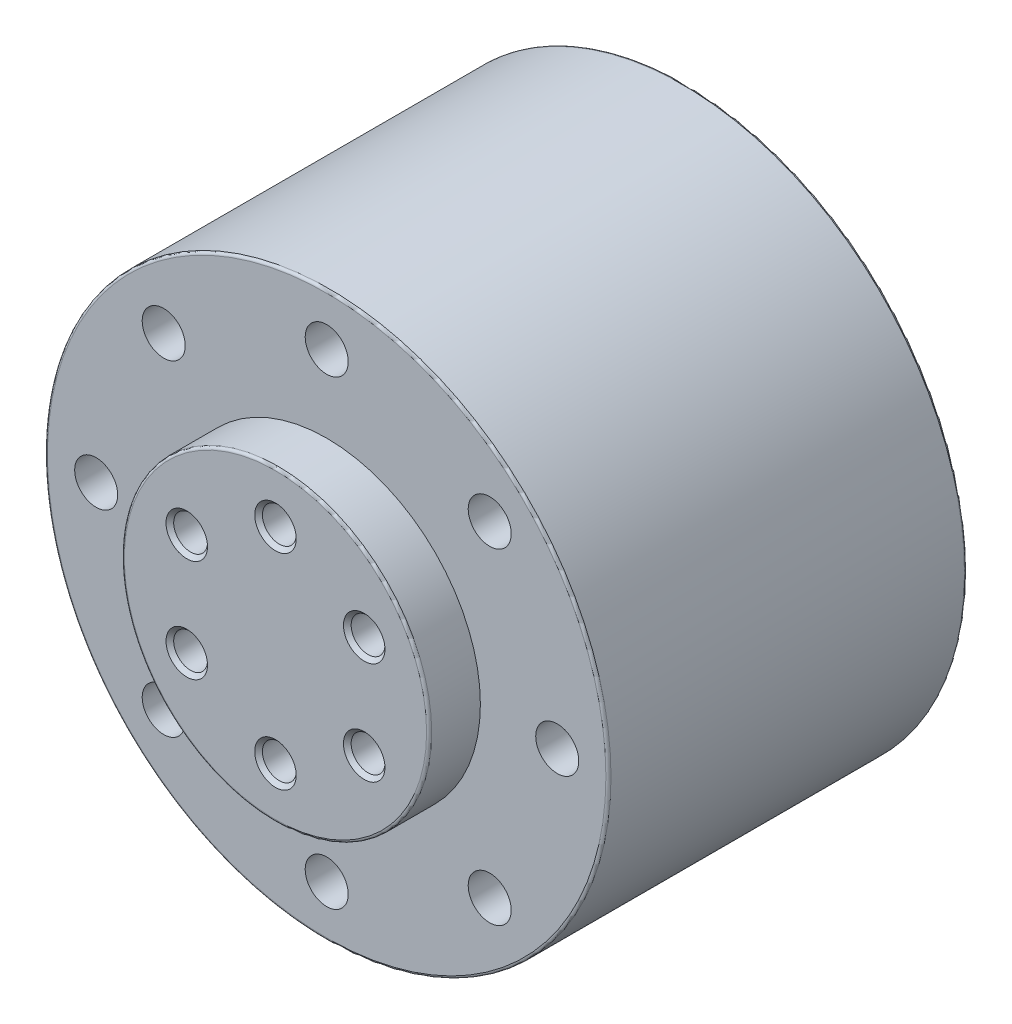
ISO-10303-21;
HEADER;
FILE_DESCRIPTION(('STEP AP214'),'2;1');
FILE_NAME('part.step','',(''),(''),'','','');
FILE_SCHEMA(('AUTOMOTIVE_DESIGN { 1 0 10303 214 1 1 1 1 }'));
ENDSEC;
DATA;
#1=APPLICATION_CONTEXT('core data for automotive mechanical design processes');
#2=APPLICATION_PROTOCOL_DEFINITION('international standard','automotive_design',2000,#1);
#3=PRODUCT_CONTEXT('',#1,'mechanical');
#4=PRODUCT('Part','Part','',(#3));
#5=PRODUCT_RELATED_PRODUCT_CATEGORY('part','',(#4));
#6=PRODUCT_DEFINITION_FORMATION('','',#4);
#7=PRODUCT_DEFINITION_CONTEXT('part definition',#1,'design');
#8=PRODUCT_DEFINITION('design','',#6,#7);
#9=PRODUCT_DEFINITION_SHAPE('','',#8);
#10=(LENGTH_UNIT() NAMED_UNIT(*) SI_UNIT(.MILLI.,.METRE.));
#11=(NAMED_UNIT(*) PLANE_ANGLE_UNIT() SI_UNIT($,.RADIAN.));
#12=(NAMED_UNIT(*) SI_UNIT($,.STERADIAN.) SOLID_ANGLE_UNIT());
#13=UNCERTAINTY_MEASURE_WITH_UNIT(LENGTH_MEASURE(1.E-05),#10,'distance_accuracy_value','');
#14=(GEOMETRIC_REPRESENTATION_CONTEXT(3) GLOBAL_UNCERTAINTY_ASSIGNED_CONTEXT((#13)) GLOBAL_UNIT_ASSIGNED_CONTEXT((#10,
#11,#12)) REPRESENTATION_CONTEXT('',''));
#15=CARTESIAN_POINT('',(0.,0.,0.));
#16=DIRECTION('',(0.,0.,1.));
#17=DIRECTION('',(1.,0.,0.));
#18=AXIS2_PLACEMENT_3D('',#15,#16,#17);
#19=CARTESIAN_POINT('',(0.,0.,0.));
#20=DIRECTION('',(0.,0.,1.));
#21=DIRECTION('',(1.,0.,0.));
#22=AXIS2_PLACEMENT_3D('',#19,#20,#21);
#23=PLANE('',#22);
#24=CARTESIAN_POINT('',(0.,0.,0.));
#25=DIRECTION('',(0.,0.,1.));
#26=DIRECTION('',(1.,0.,0.));
#27=AXIS2_PLACEMENT_3D('',#24,#25,#26);
#28=CIRCLE('',#27,27.25);
#29=CARTESIAN_POINT('',(27.25,0.,0.));
#30=VERTEX_POINT('',#29);
#31=EDGE_CURVE('E11',#30,#30,#28,.F.);
#32=ORIENTED_EDGE('',*,*,#31,.T.);
#33=EDGE_LOOP('',(#32));
#34=FACE_BOUND('',#33,.T.);
#35=CARTESIAN_POINT('',(-15.9099025766973,15.9099025766973,0.));
#36=DIRECTION('',(0.,0.,-1.));
#37=DIRECTION('',(-1.,0.,0.));
#38=AXIS2_PLACEMENT_3D('',#35,#36,#37);
#39=CIRCLE('',#38,2.525);
#40=CARTESIAN_POINT('',(-18.4349025766973,15.9099025766973,0.));
#41=VERTEX_POINT('',#40);
#42=EDGE_CURVE('E140',#41,#41,#39,.T.);
#43=ORIENTED_EDGE('',*,*,#42,.F.);
#44=EDGE_LOOP('',(#43));
#45=FACE_BOUND('',#44,.T.);
#46=CARTESIAN_POINT('',(-22.5,0.,0.));
#47=DIRECTION('',(0.,0.,-1.));
#48=DIRECTION('',(-1.,0.,0.));
#49=AXIS2_PLACEMENT_3D('',#46,#47,#48);
#50=CIRCLE('',#49,2.525);
#51=CARTESIAN_POINT('',(-25.025,0.,0.));
#52=VERTEX_POINT('',#51);
#53=EDGE_CURVE('E149',#52,#52,#50,.T.);
#54=ORIENTED_EDGE('',*,*,#53,.F.);
#55=EDGE_LOOP('',(#54));
#56=FACE_BOUND('',#55,.T.);
#57=CARTESIAN_POINT('',(-15.9099025766973,-15.9099025766973,0.));
#58=DIRECTION('',(0.,0.,-1.));
#59=DIRECTION('',(-1.,0.,0.));
#60=AXIS2_PLACEMENT_3D('',#57,#58,#59);
#61=CIRCLE('',#60,2.525);
#62=CARTESIAN_POINT('',(-18.4349025766973,-15.9099025766973,0.));
#63=VERTEX_POINT('',#62);
#64=EDGE_CURVE('E158',#63,#63,#61,.T.);
#65=ORIENTED_EDGE('',*,*,#64,.F.);
#66=EDGE_LOOP('',(#65));
#67=FACE_BOUND('',#66,.T.);
#68=CARTESIAN_POINT('',(0.,-22.5,0.));
#69=DIRECTION('',(0.,0.,-1.));
#70=DIRECTION('',(-1.,0.,0.));
#71=AXIS2_PLACEMENT_3D('',#68,#69,#70);
#72=CIRCLE('',#71,2.525);
#73=CARTESIAN_POINT('',(-2.525,-22.5,0.));
#74=VERTEX_POINT('',#73);
#75=EDGE_CURVE('E167',#74,#74,#72,.T.);
#76=ORIENTED_EDGE('',*,*,#75,.F.);
#77=EDGE_LOOP('',(#76));
#78=FACE_BOUND('',#77,.T.);
#79=CARTESIAN_POINT('',(15.9099025766973,-15.9099025766973,0.));
#80=DIRECTION('',(0.,0.,-1.));
#81=DIRECTION('',(-1.,0.,0.));
#82=AXIS2_PLACEMENT_3D('',#79,#80,#81);
#83=CIRCLE('',#82,2.525);
#84=CARTESIAN_POINT('',(13.3849025766973,-15.9099025766973,0.));
#85=VERTEX_POINT('',#84);
#86=EDGE_CURVE('E176',#85,#85,#83,.T.);
#87=ORIENTED_EDGE('',*,*,#86,.F.);
#88=EDGE_LOOP('',(#87));
#89=FACE_BOUND('',#88,.T.);
#90=CARTESIAN_POINT('',(22.5,0.,0.));
#91=DIRECTION('',(0.,0.,-1.));
#92=DIRECTION('',(-1.,0.,0.));
#93=AXIS2_PLACEMENT_3D('',#90,#91,#92);
#94=CIRCLE('',#93,2.525);
#95=CARTESIAN_POINT('',(19.975,0.,0.));
#96=VERTEX_POINT('',#95);
#97=EDGE_CURVE('E185',#96,#96,#94,.T.);
#98=ORIENTED_EDGE('',*,*,#97,.F.);
#99=EDGE_LOOP('',(#98));
#100=FACE_BOUND('',#99,.T.);
#101=CARTESIAN_POINT('',(15.9099025766973,15.9099025766973,0.));
#102=DIRECTION('',(0.,0.,-1.));
#103=DIRECTION('',(-1.,0.,0.));
#104=AXIS2_PLACEMENT_3D('',#101,#102,#103);
#105=CIRCLE('',#104,2.525);
#106=CARTESIAN_POINT('',(13.3849025766973,15.9099025766973,0.));
#107=VERTEX_POINT('',#106);
#108=EDGE_CURVE('E194',#107,#107,#105,.T.);
#109=ORIENTED_EDGE('',*,*,#108,.F.);
#110=EDGE_LOOP('',(#109));
#111=FACE_BOUND('',#110,.T.);
#112=CARTESIAN_POINT('',(0.,22.5,0.));
#113=DIRECTION('',(0.,0.,-1.));
#114=DIRECTION('',(-1.,0.,0.));
#115=AXIS2_PLACEMENT_3D('',#112,#113,#114);
#116=CIRCLE('',#115,2.525);
#117=CARTESIAN_POINT('',(-2.525,22.5,0.));
#118=VERTEX_POINT('',#117);
#119=EDGE_CURVE('E131',#118,#118,#116,.T.);
#120=ORIENTED_EDGE('',*,*,#119,.F.);
#121=EDGE_LOOP('',(#120));
#122=FACE_BOUND('',#121,.T.);
#123=ADVANCED_FACE('F42',(#34,#45,#56,#67,#78,#89,#100,#111,#122),#23,.F.);
#124=CARTESIAN_POINT('',(0.,0.,35.));
#125=DIRECTION('',(0.,0.,-1.));
#126=DIRECTION('',(-1.,0.,0.));
#127=AXIS2_PLACEMENT_3D('',#124,#125,#126);
#128=CYLINDRICAL_SURFACE('',#127,27.5);
#129=CARTESIAN_POINT('',(0.,0.,34.75));
#130=DIRECTION('',(0.,0.,1.));
#131=DIRECTION('',(1.,0.,0.));
#132=AXIS2_PLACEMENT_3D('',#129,#130,#131);
#133=CIRCLE('',#132,27.5);
#134=CARTESIAN_POINT('',(27.5,0.,34.75));
#135=VERTEX_POINT('',#134);
#136=EDGE_CURVE('E50',#135,#135,#133,.F.);
#137=ORIENTED_EDGE('',*,*,#136,.T.);
#138=EDGE_LOOP('',(#137));
#139=FACE_BOUND('',#138,.T.);
#140=CARTESIAN_POINT('',(0.,0.,0.25));
#141=DIRECTION('',(0.,0.,1.));
#142=DIRECTION('',(1.,0.,0.));
#143=AXIS2_PLACEMENT_3D('',#140,#141,#142);
#144=CIRCLE('',#143,27.5);
#145=CARTESIAN_POINT('',(27.5,0.,0.25));
#146=VERTEX_POINT('',#145);
#147=EDGE_CURVE('E215',#146,#146,#144,.T.);
#148=ORIENTED_EDGE('',*,*,#147,.T.);
#149=EDGE_LOOP('',(#148));
#150=FACE_BOUND('',#149,.T.);
#151=ADVANCED_FACE('F220',(#139,#150),#128,.T.);
#152=CARTESIAN_POINT('',(0.,0.,35.));
#153=DIRECTION('',(0.,0.,1.));
#154=DIRECTION('',(1.,0.,0.));
#155=AXIS2_PLACEMENT_3D('',#152,#153,#154);
#156=PLANE('',#155);
#157=CARTESIAN_POINT('',(0.,0.,35.));
#158=DIRECTION('',(0.,0.,1.));
#159=DIRECTION('',(1.,0.,0.));
#160=AXIS2_PLACEMENT_3D('',#157,#158,#159);
#161=CIRCLE('',#160,27.25);
#162=CARTESIAN_POINT('',(27.25,0.,35.));
#163=VERTEX_POINT('',#162);
#164=EDGE_CURVE('E212',#163,#163,#161,.T.);
#165=ORIENTED_EDGE('',*,*,#164,.T.);
#166=EDGE_LOOP('',(#165));
#167=FACE_BOUND('',#166,.T.);
#168=CARTESIAN_POINT('',(0.,22.5,35.));
#169=DIRECTION('',(0.,0.,1.));
#170=DIRECTION('',(1.,0.,0.));
#171=AXIS2_PLACEMENT_3D('',#168,#169,#170);
#172=CIRCLE('',#171,2.1);
#173=CARTESIAN_POINT('',(2.1,22.5,35.));
#174=VERTEX_POINT('',#173);
#175=EDGE_CURVE('E137',#174,#174,#172,.T.);
#176=ORIENTED_EDGE('',*,*,#175,.F.);
#177=EDGE_LOOP('',(#176));
#178=FACE_BOUND('',#177,.T.);
#179=CARTESIAN_POINT('',(-15.9099025766973,15.9099025766973,35.));
#180=DIRECTION('',(0.,0.,1.));
#181=DIRECTION('',(1.,0.,0.));
#182=AXIS2_PLACEMENT_3D('',#179,#180,#181);
#183=CIRCLE('',#182,2.09999999999999);
#184=CARTESIAN_POINT('',(-13.8099025766973,15.9099025766973,35.));
#185=VERTEX_POINT('',#184);
#186=EDGE_CURVE('E146',#185,#185,#183,.T.);
#187=ORIENTED_EDGE('',*,*,#186,.F.);
#188=EDGE_LOOP('',(#187));
#189=FACE_BOUND('',#188,.T.);
#190=CARTESIAN_POINT('',(-22.5,0.,35.));
#191=DIRECTION('',(0.,0.,1.));
#192=DIRECTION('',(1.,0.,0.));
#193=AXIS2_PLACEMENT_3D('',#190,#191,#192);
#194=CIRCLE('',#193,2.09999999999999);
#195=CARTESIAN_POINT('',(-20.4,0.,35.));
#196=VERTEX_POINT('',#195);
#197=EDGE_CURVE('E155',#196,#196,#194,.T.);
#198=ORIENTED_EDGE('',*,*,#197,.F.);
#199=EDGE_LOOP('',(#198));
#200=FACE_BOUND('',#199,.T.);
#201=CARTESIAN_POINT('',(-15.9099025766973,-15.9099025766973,35.));
#202=DIRECTION('',(0.,0.,1.));
#203=DIRECTION('',(1.,0.,0.));
#204=AXIS2_PLACEMENT_3D('',#201,#202,#203);
#205=CIRCLE('',#204,2.09999999999999);
#206=CARTESIAN_POINT('',(-13.8099025766973,-15.9099025766973,35.));
#207=VERTEX_POINT('',#206);
#208=EDGE_CURVE('E164',#207,#207,#205,.T.);
#209=ORIENTED_EDGE('',*,*,#208,.F.);
#210=EDGE_LOOP('',(#209));
#211=FACE_BOUND('',#210,.T.);
#212=CARTESIAN_POINT('',(0.,-22.5,35.));
#213=DIRECTION('',(0.,0.,1.));
#214=DIRECTION('',(1.,0.,0.));
#215=AXIS2_PLACEMENT_3D('',#212,#213,#214);
#216=CIRCLE('',#215,2.1);
#217=CARTESIAN_POINT('',(2.09999999999999,-22.5,35.));
#218=VERTEX_POINT('',#217);
#219=EDGE_CURVE('E173',#218,#218,#216,.T.);
#220=ORIENTED_EDGE('',*,*,#219,.F.);
#221=EDGE_LOOP('',(#220));
#222=FACE_BOUND('',#221,.T.);
#223=CARTESIAN_POINT('',(15.9099025766973,-15.9099025766973,35.));
#224=DIRECTION('',(0.,0.,1.));
#225=DIRECTION('',(1.,0.,0.));
#226=AXIS2_PLACEMENT_3D('',#223,#224,#225);
#227=CIRCLE('',#226,2.09999999999999);
#228=CARTESIAN_POINT('',(18.0099025766973,-15.9099025766973,35.));
#229=VERTEX_POINT('',#228);
#230=EDGE_CURVE('E182',#229,#229,#227,.T.);
#231=ORIENTED_EDGE('',*,*,#230,.F.);
#232=EDGE_LOOP('',(#231));
#233=FACE_BOUND('',#232,.T.);
#234=CARTESIAN_POINT('',(22.5,0.,35.));
#235=DIRECTION('',(0.,0.,1.));
#236=DIRECTION('',(1.,0.,0.));
#237=AXIS2_PLACEMENT_3D('',#234,#235,#236);
#238=CIRCLE('',#237,2.09999999999999);
#239=CARTESIAN_POINT('',(24.6,0.,35.));
#240=VERTEX_POINT('',#239);
#241=EDGE_CURVE('E191',#240,#240,#238,.T.);
#242=ORIENTED_EDGE('',*,*,#241,.F.);
#243=EDGE_LOOP('',(#242));
#244=FACE_BOUND('',#243,.T.);
#245=CARTESIAN_POINT('',(15.9099025766973,15.9099025766973,35.));
#246=DIRECTION('',(0.,0.,1.));
#247=DIRECTION('',(1.,0.,0.));
#248=AXIS2_PLACEMENT_3D('',#245,#246,#247);
#249=CIRCLE('',#248,2.09999999999999);
#250=CARTESIAN_POINT('',(18.0099025766973,15.9099025766973,35.));
#251=VERTEX_POINT('',#250);
#252=EDGE_CURVE('E200',#251,#251,#249,.T.);
#253=ORIENTED_EDGE('',*,*,#252,.F.);
#254=EDGE_LOOP('',(#253));
#255=FACE_BOUND('',#254,.T.);
#256=CARTESIAN_POINT('',(0.,0.,35.));
#257=DIRECTION('',(0.,0.,1.));
#258=DIRECTION('',(1.,0.,0.));
#259=AXIS2_PLACEMENT_3D('',#256,#257,#258);
#260=CIRCLE('',#259,15.);
#261=CARTESIAN_POINT('',(15.,0.,35.));
#262=VERTEX_POINT('',#261);
#263=EDGE_CURVE('E203',#262,#262,#260,.T.);
#264=ORIENTED_EDGE('',*,*,#263,.F.);
#265=EDGE_LOOP('',(#264));
#266=FACE_BOUND('',#265,.T.);
#267=ADVANCED_FACE('F229',(#167,#178,#189,#200,#211,#222,#233,#244,#255,#266),#156,.T.);
#268=CARTESIAN_POINT('',(0.,0.,40.));
#269=DIRECTION('',(0.,0.,-1.));
#270=DIRECTION('',(-1.,0.,0.));
#271=AXIS2_PLACEMENT_3D('',#268,#269,#270);
#272=CYLINDRICAL_SURFACE('',#271,15.);
#273=CARTESIAN_POINT('',(0.,0.,39.75));
#274=DIRECTION('',(0.,0.,1.));
#275=DIRECTION('',(1.,0.,0.));
#276=AXIS2_PLACEMENT_3D('',#273,#274,#275);
#277=CIRCLE('',#276,15.);
#278=CARTESIAN_POINT('',(15.,0.,39.75));
#279=VERTEX_POINT('',#278);
#280=EDGE_CURVE('E209',#279,#279,#277,.F.);
#281=ORIENTED_EDGE('',*,*,#280,.T.);
#282=EDGE_LOOP('',(#281));
#283=FACE_BOUND('',#282,.T.);
#284=ORIENTED_EDGE('',*,*,#263,.T.);
#285=EDGE_LOOP('',(#284));
#286=FACE_BOUND('',#285,.T.);
#287=ADVANCED_FACE('F232',(#283,#286),#272,.T.);
#288=CARTESIAN_POINT('',(0.,0.,40.));
#289=DIRECTION('',(0.,0.,1.));
#290=DIRECTION('',(1.,0.,0.));
#291=AXIS2_PLACEMENT_3D('',#288,#289,#290);
#292=PLANE('',#291);
#293=CARTESIAN_POINT('',(0.,0.,40.));
#294=DIRECTION('',(0.,0.,1.));
#295=DIRECTION('',(1.,0.,0.));
#296=AXIS2_PLACEMENT_3D('',#293,#294,#295);
#297=CIRCLE('',#296,14.75);
#298=CARTESIAN_POINT('',(14.75,0.,40.));
#299=VERTEX_POINT('',#298);
#300=EDGE_CURVE('E206',#299,#299,#297,.T.);
#301=ORIENTED_EDGE('',*,*,#300,.T.);
#302=EDGE_LOOP('',(#301));
#303=FACE_BOUND('',#302,.T.);
#304=CARTESIAN_POINT('',(0.,10.,40.));
#305=DIRECTION('',(0.,0.,1.));
#306=DIRECTION('',(1.,0.,0.));
#307=AXIS2_PLACEMENT_3D('',#304,#305,#306);
#308=CIRCLE('',#307,2.025);
#309=CARTESIAN_POINT('',(2.025,10.,40.));
#310=VERTEX_POINT('',#309);
#311=EDGE_CURVE('E86',#310,#310,#308,.T.);
#312=ORIENTED_EDGE('',*,*,#311,.F.);
#313=EDGE_LOOP('',(#312));
#314=FACE_BOUND('',#313,.T.);
#315=CARTESIAN_POINT('',(8.66025403784439,5.,40.));
#316=DIRECTION('',(0.,0.,1.));
#317=DIRECTION('',(1.,0.,0.));
#318=AXIS2_PLACEMENT_3D('',#315,#316,#317);
#319=CIRCLE('',#318,2.025);
#320=CARTESIAN_POINT('',(10.6852540378444,5.,40.));
#321=VERTEX_POINT('',#320);
#322=EDGE_CURVE('E79',#321,#321,#319,.T.);
#323=ORIENTED_EDGE('',*,*,#322,.F.);
#324=EDGE_LOOP('',(#323));
#325=FACE_BOUND('',#324,.T.);
#326=CARTESIAN_POINT('',(8.66025403784439,-5.,40.));
#327=DIRECTION('',(0.,0.,1.));
#328=DIRECTION('',(1.,0.,0.));
#329=AXIS2_PLACEMENT_3D('',#326,#327,#328);
#330=CIRCLE('',#329,2.025);
#331=CARTESIAN_POINT('',(10.6852540378444,-5.,40.));
#332=VERTEX_POINT('',#331);
#333=EDGE_CURVE('E95',#332,#332,#330,.T.);
#334=ORIENTED_EDGE('',*,*,#333,.F.);
#335=EDGE_LOOP('',(#334));
#336=FACE_BOUND('',#335,.T.);
#337=CARTESIAN_POINT('',(0.,-10.,40.));
#338=DIRECTION('',(0.,0.,1.));
#339=DIRECTION('',(1.,0.,0.));
#340=AXIS2_PLACEMENT_3D('',#337,#338,#339);
#341=CIRCLE('',#340,2.025);
#342=CARTESIAN_POINT('',(2.025,-10.,40.));
#343=VERTEX_POINT('',#342);
#344=EDGE_CURVE('E104',#343,#343,#341,.T.);
#345=ORIENTED_EDGE('',*,*,#344,.F.);
#346=EDGE_LOOP('',(#345));
#347=FACE_BOUND('',#346,.T.);
#348=CARTESIAN_POINT('',(-8.66025403784439,-5.00000000000001,40.));
#349=DIRECTION('',(0.,0.,1.));
#350=DIRECTION('',(1.,0.,0.));
#351=AXIS2_PLACEMENT_3D('',#348,#349,#350);
#352=CIRCLE('',#351,2.025);
#353=CARTESIAN_POINT('',(-6.63525403784439,-5.00000000000001,40.));
#354=VERTEX_POINT('',#353);
#355=EDGE_CURVE('E113',#354,#354,#352,.T.);
#356=ORIENTED_EDGE('',*,*,#355,.F.);
#357=EDGE_LOOP('',(#356));
#358=FACE_BOUND('',#357,.T.);
#359=CARTESIAN_POINT('',(-8.66025403784439,4.99999999999999,40.));
#360=DIRECTION('',(0.,0.,1.));
#361=DIRECTION('',(1.,0.,0.));
#362=AXIS2_PLACEMENT_3D('',#359,#360,#361);
#363=CIRCLE('',#362,2.025);
#364=CARTESIAN_POINT('',(-6.63525403784439,4.99999999999999,40.));
#365=VERTEX_POINT('',#364);
#366=EDGE_CURVE('E122',#365,#365,#363,.T.);
#367=ORIENTED_EDGE('',*,*,#366,.F.);
#368=EDGE_LOOP('',(#367));
#369=FACE_BOUND('',#368,.T.);
#370=ADVANCED_FACE('F253',(#303,#314,#325,#336,#347,#358,#369),#292,.T.);
#371=CARTESIAN_POINT('',(15.9099025766973,15.9099025766973,0.));
#372=DIRECTION('',(0.,0.,-1.));
#373=DIRECTION('',(-1.,0.,0.));
#374=AXIS2_PLACEMENT_3D('',#371,#372,#373);
#375=CYLINDRICAL_SURFACE('',#374,2.09999999999999);
#376=CARTESIAN_POINT('',(15.9099025766973,15.9099025766973,0.425000000000003));
#377=DIRECTION('',(0.,0.,-1.));
#378=DIRECTION('',(-1.,0.,0.));
#379=AXIS2_PLACEMENT_3D('',#376,#377,#378);
#380=CIRCLE('',#379,2.1);
#381=CARTESIAN_POINT('',(13.8099025766973,15.9099025766973,0.425000000000003));
#382=VERTEX_POINT('',#381);
#383=EDGE_CURVE('E197',#382,#382,#380,.T.);
#384=ORIENTED_EDGE('',*,*,#383,.T.);
#385=EDGE_LOOP('',(#384));
#386=FACE_BOUND('',#385,.T.);
#387=ORIENTED_EDGE('',*,*,#252,.T.);
#388=EDGE_LOOP('',(#387));
#389=FACE_BOUND('',#388,.T.);
#390=ADVANCED_FACE('F259',(#386,#389),#375,.F.);
#391=CARTESIAN_POINT('',(15.9099025766973,15.9099025766973,0.));
#392=DIRECTION('',(0.,0.,-1.));
#393=DIRECTION('',(-1.,0.,0.));
#394=AXIS2_PLACEMENT_3D('',#391,#392,#393);
#395=CONICAL_SURFACE('',#394,2.525,0.785398163397444);
#396=ORIENTED_EDGE('',*,*,#383,.F.);
#397=EDGE_LOOP('',(#396));
#398=FACE_BOUND('',#397,.T.);
#399=ORIENTED_EDGE('',*,*,#108,.T.);
#400=EDGE_LOOP('',(#399));
#401=FACE_BOUND('',#400,.T.);
#402=ADVANCED_FACE('F371',(#398,#401),#395,.F.);
#403=CARTESIAN_POINT('',(22.5,0.,0.));
#404=DIRECTION('',(0.,0.,-1.));
#405=DIRECTION('',(-1.,0.,0.));
#406=AXIS2_PLACEMENT_3D('',#403,#404,#405);
#407=CYLINDRICAL_SURFACE('',#406,2.09999999999999);
#408=CARTESIAN_POINT('',(22.5,0.,0.425000000000003));
#409=DIRECTION('',(0.,0.,-1.));
#410=DIRECTION('',(-1.,0.,0.));
#411=AXIS2_PLACEMENT_3D('',#408,#409,#410);
#412=CIRCLE('',#411,2.1);
#413=CARTESIAN_POINT('',(20.4,0.,0.425000000000003));
#414=VERTEX_POINT('',#413);
#415=EDGE_CURVE('E188',#414,#414,#412,.T.);
#416=ORIENTED_EDGE('',*,*,#415,.T.);
#417=EDGE_LOOP('',(#416));
#418=FACE_BOUND('',#417,.T.);
#419=ORIENTED_EDGE('',*,*,#241,.T.);
#420=EDGE_LOOP('',(#419));
#421=FACE_BOUND('',#420,.T.);
#422=ADVANCED_FACE('F367',(#418,#421),#407,.F.);
#423=CARTESIAN_POINT('',(22.5,0.,0.));
#424=DIRECTION('',(0.,0.,-1.));
#425=DIRECTION('',(-1.,0.,0.));
#426=AXIS2_PLACEMENT_3D('',#423,#424,#425);
#427=CONICAL_SURFACE('',#426,2.525,0.785398163397444);
#428=ORIENTED_EDGE('',*,*,#415,.F.);
#429=EDGE_LOOP('',(#428));
#430=FACE_BOUND('',#429,.T.);
#431=ORIENTED_EDGE('',*,*,#97,.T.);
#432=EDGE_LOOP('',(#431));
#433=FACE_BOUND('',#432,.T.);
#434=ADVANCED_FACE('F363',(#430,#433),#427,.F.);
#435=CARTESIAN_POINT('',(15.9099025766973,-15.9099025766973,0.));
#436=DIRECTION('',(0.,0.,-1.));
#437=DIRECTION('',(-1.,0.,0.));
#438=AXIS2_PLACEMENT_3D('',#435,#436,#437);
#439=CYLINDRICAL_SURFACE('',#438,2.09999999999999);
#440=CARTESIAN_POINT('',(15.9099025766973,-15.9099025766973,0.425000000000003));
#441=DIRECTION('',(0.,0.,-1.));
#442=DIRECTION('',(-1.,0.,0.));
#443=AXIS2_PLACEMENT_3D('',#440,#441,#442);
#444=CIRCLE('',#443,2.1);
#445=CARTESIAN_POINT('',(13.8099025766973,-15.9099025766973,0.425000000000003));
#446=VERTEX_POINT('',#445);
#447=EDGE_CURVE('E179',#446,#446,#444,.T.);
#448=ORIENTED_EDGE('',*,*,#447,.T.);
#449=EDGE_LOOP('',(#448));
#450=FACE_BOUND('',#449,.T.);
#451=ORIENTED_EDGE('',*,*,#230,.T.);
#452=EDGE_LOOP('',(#451));
#453=FACE_BOUND('',#452,.T.);
#454=ADVANCED_FACE('F359',(#450,#453),#439,.F.);
#455=CARTESIAN_POINT('',(15.9099025766973,-15.9099025766973,0.));
#456=DIRECTION('',(0.,0.,-1.));
#457=DIRECTION('',(-1.,0.,0.));
#458=AXIS2_PLACEMENT_3D('',#455,#456,#457);
#459=CONICAL_SURFACE('',#458,2.525,0.785398163397444);
#460=ORIENTED_EDGE('',*,*,#447,.F.);
#461=EDGE_LOOP('',(#460));
#462=FACE_BOUND('',#461,.T.);
#463=ORIENTED_EDGE('',*,*,#86,.T.);
#464=EDGE_LOOP('',(#463));
#465=FACE_BOUND('',#464,.T.);
#466=ADVANCED_FACE('F355',(#462,#465),#459,.F.);
#467=CARTESIAN_POINT('',(0.,-22.5,0.));
#468=DIRECTION('',(0.,0.,-1.));
#469=DIRECTION('',(-1.,0.,0.));
#470=AXIS2_PLACEMENT_3D('',#467,#468,#469);
#471=CYLINDRICAL_SURFACE('',#470,2.1);
#472=CARTESIAN_POINT('',(0.,-22.5,0.425000000000003));
#473=DIRECTION('',(0.,0.,-1.));
#474=DIRECTION('',(-1.,0.,0.));
#475=AXIS2_PLACEMENT_3D('',#472,#473,#474);
#476=CIRCLE('',#475,2.1);
#477=CARTESIAN_POINT('',(-2.1,-22.5,0.425000000000003));
#478=VERTEX_POINT('',#477);
#479=EDGE_CURVE('E170',#478,#478,#476,.T.);
#480=ORIENTED_EDGE('',*,*,#479,.T.);
#481=EDGE_LOOP('',(#480));
#482=FACE_BOUND('',#481,.T.);
#483=ORIENTED_EDGE('',*,*,#219,.T.);
#484=EDGE_LOOP('',(#483));
#485=FACE_BOUND('',#484,.T.);
#486=ADVANCED_FACE('F351',(#482,#485),#471,.F.);
#487=CARTESIAN_POINT('',(0.,-22.5,0.));
#488=DIRECTION('',(0.,0.,-1.));
#489=DIRECTION('',(-1.,0.,0.));
#490=AXIS2_PLACEMENT_3D('',#487,#488,#489);
#491=CONICAL_SURFACE('',#490,2.525,0.785398163397443);
#492=ORIENTED_EDGE('',*,*,#479,.F.);
#493=EDGE_LOOP('',(#492));
#494=FACE_BOUND('',#493,.T.);
#495=ORIENTED_EDGE('',*,*,#75,.T.);
#496=EDGE_LOOP('',(#495));
#497=FACE_BOUND('',#496,.T.);
#498=ADVANCED_FACE('F347',(#494,#497),#491,.F.);
#499=CARTESIAN_POINT('',(-15.9099025766973,-15.9099025766973,0.));
#500=DIRECTION('',(0.,0.,-1.));
#501=DIRECTION('',(-1.,0.,0.));
#502=AXIS2_PLACEMENT_3D('',#499,#500,#501);
#503=CYLINDRICAL_SURFACE('',#502,2.09999999999999);
#504=CARTESIAN_POINT('',(-15.9099025766973,-15.9099025766973,0.425000000000003));
#505=DIRECTION('',(0.,0.,-1.));
#506=DIRECTION('',(-1.,0.,0.));
#507=AXIS2_PLACEMENT_3D('',#504,#505,#506);
#508=CIRCLE('',#507,2.1);
#509=CARTESIAN_POINT('',(-18.0099025766973,-15.9099025766973,0.425000000000003));
#510=VERTEX_POINT('',#509);
#511=EDGE_CURVE('E161',#510,#510,#508,.T.);
#512=ORIENTED_EDGE('',*,*,#511,.T.);
#513=EDGE_LOOP('',(#512));
#514=FACE_BOUND('',#513,.T.);
#515=ORIENTED_EDGE('',*,*,#208,.T.);
#516=EDGE_LOOP('',(#515));
#517=FACE_BOUND('',#516,.T.);
#518=ADVANCED_FACE('F343',(#514,#517),#503,.F.);
#519=CARTESIAN_POINT('',(-15.9099025766973,-15.9099025766973,0.));
#520=DIRECTION('',(0.,0.,-1.));
#521=DIRECTION('',(-1.,0.,0.));
#522=AXIS2_PLACEMENT_3D('',#519,#520,#521);
#523=CONICAL_SURFACE('',#522,2.525,0.785398163397444);
#524=ORIENTED_EDGE('',*,*,#511,.F.);
#525=EDGE_LOOP('',(#524));
#526=FACE_BOUND('',#525,.T.);
#527=ORIENTED_EDGE('',*,*,#64,.T.);
#528=EDGE_LOOP('',(#527));
#529=FACE_BOUND('',#528,.T.);
#530=ADVANCED_FACE('F339',(#526,#529),#523,.F.);
#531=CARTESIAN_POINT('',(-22.5,0.,0.));
#532=DIRECTION('',(0.,0.,-1.));
#533=DIRECTION('',(-1.,0.,0.));
#534=AXIS2_PLACEMENT_3D('',#531,#532,#533);
#535=CYLINDRICAL_SURFACE('',#534,2.09999999999999);
#536=CARTESIAN_POINT('',(-22.5,0.,0.425000000000003));
#537=DIRECTION('',(0.,0.,-1.));
#538=DIRECTION('',(-1.,0.,0.));
#539=AXIS2_PLACEMENT_3D('',#536,#537,#538);
#540=CIRCLE('',#539,2.1);
#541=CARTESIAN_POINT('',(-24.6,0.,0.425000000000003));
#542=VERTEX_POINT('',#541);
#543=EDGE_CURVE('E152',#542,#542,#540,.T.);
#544=ORIENTED_EDGE('',*,*,#543,.T.);
#545=EDGE_LOOP('',(#544));
#546=FACE_BOUND('',#545,.T.);
#547=ORIENTED_EDGE('',*,*,#197,.T.);
#548=EDGE_LOOP('',(#547));
#549=FACE_BOUND('',#548,.T.);
#550=ADVANCED_FACE('F335',(#546,#549),#535,.F.);
#551=CARTESIAN_POINT('',(-22.5,0.,0.));
#552=DIRECTION('',(0.,0.,-1.));
#553=DIRECTION('',(-1.,0.,0.));
#554=AXIS2_PLACEMENT_3D('',#551,#552,#553);
#555=CONICAL_SURFACE('',#554,2.525,0.785398163397444);
#556=ORIENTED_EDGE('',*,*,#543,.F.);
#557=EDGE_LOOP('',(#556));
#558=FACE_BOUND('',#557,.T.);
#559=ORIENTED_EDGE('',*,*,#53,.T.);
#560=EDGE_LOOP('',(#559));
#561=FACE_BOUND('',#560,.T.);
#562=ADVANCED_FACE('F331',(#558,#561),#555,.F.);
#563=CARTESIAN_POINT('',(-15.9099025766973,15.9099025766973,0.));
#564=DIRECTION('',(0.,0.,-1.));
#565=DIRECTION('',(-1.,0.,0.));
#566=AXIS2_PLACEMENT_3D('',#563,#564,#565);
#567=CYLINDRICAL_SURFACE('',#566,2.09999999999999);
#568=CARTESIAN_POINT('',(-15.9099025766973,15.9099025766973,0.425000000000003));
#569=DIRECTION('',(0.,0.,-1.));
#570=DIRECTION('',(-1.,0.,0.));
#571=AXIS2_PLACEMENT_3D('',#568,#569,#570);
#572=CIRCLE('',#571,2.1);
#573=CARTESIAN_POINT('',(-18.0099025766973,15.9099025766973,0.425000000000003));
#574=VERTEX_POINT('',#573);
#575=EDGE_CURVE('E143',#574,#574,#572,.T.);
#576=ORIENTED_EDGE('',*,*,#575,.T.);
#577=EDGE_LOOP('',(#576));
#578=FACE_BOUND('',#577,.T.);
#579=ORIENTED_EDGE('',*,*,#186,.T.);
#580=EDGE_LOOP('',(#579));
#581=FACE_BOUND('',#580,.T.);
#582=ADVANCED_FACE('F327',(#578,#581),#567,.F.);
#583=CARTESIAN_POINT('',(-15.9099025766973,15.9099025766973,0.));
#584=DIRECTION('',(0.,0.,-1.));
#585=DIRECTION('',(-1.,0.,0.));
#586=AXIS2_PLACEMENT_3D('',#583,#584,#585);
#587=CONICAL_SURFACE('',#586,2.525,0.785398163397444);
#588=ORIENTED_EDGE('',*,*,#575,.F.);
#589=EDGE_LOOP('',(#588));
#590=FACE_BOUND('',#589,.T.);
#591=ORIENTED_EDGE('',*,*,#42,.T.);
#592=EDGE_LOOP('',(#591));
#593=FACE_BOUND('',#592,.T.);
#594=ADVANCED_FACE('F323',(#590,#593),#587,.F.);
#595=CARTESIAN_POINT('',(0.,22.5,0.));
#596=DIRECTION('',(0.,0.,-1.));
#597=DIRECTION('',(-1.,0.,0.));
#598=AXIS2_PLACEMENT_3D('',#595,#596,#597);
#599=CYLINDRICAL_SURFACE('',#598,2.1);
#600=CARTESIAN_POINT('',(0.,22.5,0.425000000000003));
#601=DIRECTION('',(0.,0.,-1.));
#602=DIRECTION('',(-1.,0.,0.));
#603=AXIS2_PLACEMENT_3D('',#600,#601,#602);
#604=CIRCLE('',#603,2.1);
#605=CARTESIAN_POINT('',(-2.1,22.5,0.425000000000003));
#606=VERTEX_POINT('',#605);
#607=EDGE_CURVE('E134',#606,#606,#604,.T.);
#608=ORIENTED_EDGE('',*,*,#607,.T.);
#609=EDGE_LOOP('',(#608));
#610=FACE_BOUND('',#609,.T.);
#611=ORIENTED_EDGE('',*,*,#175,.T.);
#612=EDGE_LOOP('',(#611));
#613=FACE_BOUND('',#612,.T.);
#614=ADVANCED_FACE('F319',(#610,#613),#599,.F.);
#615=CARTESIAN_POINT('',(0.,22.5,0.));
#616=DIRECTION('',(0.,0.,-1.));
#617=DIRECTION('',(-1.,0.,0.));
#618=AXIS2_PLACEMENT_3D('',#615,#616,#617);
#619=CONICAL_SURFACE('',#618,2.525,0.785398163397443);
#620=ORIENTED_EDGE('',*,*,#607,.F.);
#621=EDGE_LOOP('',(#620));
#622=FACE_BOUND('',#621,.T.);
#623=ORIENTED_EDGE('',*,*,#119,.T.);
#624=EDGE_LOOP('',(#623));
#625=FACE_BOUND('',#624,.T.);
#626=ADVANCED_FACE('F316',(#622,#625),#619,.F.);
#627=CARTESIAN_POINT('',(-8.66025403784439,4.99999999999999,29.9));
#628=DIRECTION('',(0.,0.,1.));
#629=DIRECTION('',(1.,0.,0.));
#630=AXIS2_PLACEMENT_3D('',#627,#628,#629);
#631=CONICAL_SURFACE('',#630,1.65,1.02974425867665);
#632=CARTESIAN_POINT('',(-8.66025403784439,4.99999999999999,28.9085799786045));
#633=VERTEX_POINT('',#632);
#634=VERTEX_LOOP('',#633);
#635=FACE_BOUND('',#634,.T.);
#636=CARTESIAN_POINT('',(-8.66025403784439,4.99999999999999,29.9));
#637=DIRECTION('',(0.,0.,1.));
#638=DIRECTION('',(1.,0.,0.));
#639=AXIS2_PLACEMENT_3D('',#636,#637,#638);
#640=CIRCLE('',#639,1.65);
#641=CARTESIAN_POINT('',(-7.01025403784439,4.99999999999999,29.9));
#642=VERTEX_POINT('',#641);
#643=EDGE_CURVE('E128',#642,#642,#640,.T.);
#644=ORIENTED_EDGE('',*,*,#643,.T.);
#645=EDGE_LOOP('',(#644));
#646=FACE_BOUND('',#645,.T.);
#647=ADVANCED_FACE('F308',(#635,#646),#631,.F.);
#648=CARTESIAN_POINT('',(-8.66025403784439,4.99999999999999,40.));
#649=DIRECTION('',(0.,0.,1.));
#650=DIRECTION('',(1.,0.,0.));
#651=AXIS2_PLACEMENT_3D('',#648,#649,#650);
#652=CYLINDRICAL_SURFACE('',#651,1.65);
#653=ORIENTED_EDGE('',*,*,#643,.F.);
#654=EDGE_LOOP('',(#653));
#655=FACE_BOUND('',#654,.T.);
#656=CARTESIAN_POINT('',(-8.66025403784439,4.99999999999999,39.625));
#657=DIRECTION('',(0.,0.,1.));
#658=DIRECTION('',(1.,0.,0.));
#659=AXIS2_PLACEMENT_3D('',#656,#657,#658);
#660=CIRCLE('',#659,1.65);
#661=CARTESIAN_POINT('',(-7.01025403784439,4.99999999999999,39.625));
#662=VERTEX_POINT('',#661);
#663=EDGE_CURVE('E125',#662,#662,#660,.T.);
#664=ORIENTED_EDGE('',*,*,#663,.T.);
#665=EDGE_LOOP('',(#664));
#666=FACE_BOUND('',#665,.T.);
#667=ADVANCED_FACE('F299',(#655,#666),#652,.F.);
#668=CARTESIAN_POINT('',(-8.66025403784439,4.99999999999999,40.));
#669=DIRECTION('',(0.,0.,1.));
#670=DIRECTION('',(1.,0.,0.));
#671=AXIS2_PLACEMENT_3D('',#668,#669,#670);
#672=CONICAL_SURFACE('',#671,2.025,0.78539816339745);
#673=ORIENTED_EDGE('',*,*,#663,.F.);
#674=EDGE_LOOP('',(#673));
#675=FACE_BOUND('',#674,.T.);
#676=ORIENTED_EDGE('',*,*,#366,.T.);
#677=EDGE_LOOP('',(#676));
#678=FACE_BOUND('',#677,.T.);
#679=ADVANCED_FACE('F296',(#675,#678),#672,.F.);
#680=CARTESIAN_POINT('',(-8.66025403784439,-5.00000000000001,29.9));
#681=DIRECTION('',(0.,0.,1.));
#682=DIRECTION('',(1.,0.,0.));
#683=AXIS2_PLACEMENT_3D('',#680,#681,#682);
#684=CONICAL_SURFACE('',#683,1.65,1.02974425867665);
#685=CARTESIAN_POINT('',(-8.66025403784439,-5.00000000000001,28.9085799786045));
#686=VERTEX_POINT('',#685);
#687=VERTEX_LOOP('',#686);
#688=FACE_BOUND('',#687,.T.);
#689=CARTESIAN_POINT('',(-8.66025403784439,-5.00000000000001,29.9));
#690=DIRECTION('',(0.,0.,1.));
#691=DIRECTION('',(1.,0.,0.));
#692=AXIS2_PLACEMENT_3D('',#689,#690,#691);
#693=CIRCLE('',#692,1.65);
#694=CARTESIAN_POINT('',(-7.01025403784439,-5.00000000000001,29.9));
#695=VERTEX_POINT('',#694);
#696=EDGE_CURVE('E119',#695,#695,#693,.T.);
#697=ORIENTED_EDGE('',*,*,#696,.T.);
#698=EDGE_LOOP('',(#697));
#699=FACE_BOUND('',#698,.T.);
#700=ADVANCED_FACE('F298',(#688,#699),#684,.F.);
#701=CARTESIAN_POINT('',(-8.66025403784439,-5.00000000000001,40.));
#702=DIRECTION('',(0.,0.,1.));
#703=DIRECTION('',(1.,0.,0.));
#704=AXIS2_PLACEMENT_3D('',#701,#702,#703);
#705=CYLINDRICAL_SURFACE('',#704,1.65);
#706=ORIENTED_EDGE('',*,*,#696,.F.);
#707=EDGE_LOOP('',(#706));
#708=FACE_BOUND('',#707,.T.);
#709=CARTESIAN_POINT('',(-8.66025403784439,-5.00000000000001,39.625));
#710=DIRECTION('',(0.,0.,1.));
#711=DIRECTION('',(1.,0.,0.));
#712=AXIS2_PLACEMENT_3D('',#709,#710,#711);
#713=CIRCLE('',#712,1.65);
#714=CARTESIAN_POINT('',(-7.01025403784439,-5.00000000000001,39.625));
#715=VERTEX_POINT('',#714);
#716=EDGE_CURVE('E116',#715,#715,#713,.T.);
#717=ORIENTED_EDGE('',*,*,#716,.T.);
#718=EDGE_LOOP('',(#717));
#719=FACE_BOUND('',#718,.T.);
#720=ADVANCED_FACE('F306',(#708,#719),#705,.F.);
#721=CARTESIAN_POINT('',(-8.66025403784439,-5.00000000000001,40.));
#722=DIRECTION('',(0.,0.,1.));
#723=DIRECTION('',(1.,0.,0.));
#724=AXIS2_PLACEMENT_3D('',#721,#722,#723);
#725=CONICAL_SURFACE('',#724,2.025,0.78539816339745);
#726=ORIENTED_EDGE('',*,*,#716,.F.);
#727=EDGE_LOOP('',(#726));
#728=FACE_BOUND('',#727,.T.);
#729=ORIENTED_EDGE('',*,*,#355,.T.);
#730=EDGE_LOOP('',(#729));
#731=FACE_BOUND('',#730,.T.);
#732=ADVANCED_FACE('F475',(#728,#731),#725,.F.);
#733=CARTESIAN_POINT('',(0.,-10.,29.9));
#734=DIRECTION('',(0.,0.,1.));
#735=DIRECTION('',(1.,0.,0.));
#736=AXIS2_PLACEMENT_3D('',#733,#734,#735);
#737=CONICAL_SURFACE('',#736,1.65,1.02974425867665);
#738=CARTESIAN_POINT('',(0.,-10.,28.9085799786045));
#739=VERTEX_POINT('',#738);
#740=VERTEX_LOOP('',#739);
#741=FACE_BOUND('',#740,.T.);
#742=CARTESIAN_POINT('',(0.,-10.,29.9));
#743=DIRECTION('',(0.,0.,1.));
#744=DIRECTION('',(1.,0.,0.));
#745=AXIS2_PLACEMENT_3D('',#742,#743,#744);
#746=CIRCLE('',#745,1.65);
#747=CARTESIAN_POINT('',(1.65,-10.,29.9));
#748=VERTEX_POINT('',#747);
#749=EDGE_CURVE('E110',#748,#748,#746,.T.);
#750=ORIENTED_EDGE('',*,*,#749,.T.);
#751=EDGE_LOOP('',(#750));
#752=FACE_BOUND('',#751,.T.);
#753=ADVANCED_FACE('F487',(#741,#752),#737,.F.);
#754=CARTESIAN_POINT('',(0.,-10.,40.));
#755=DIRECTION('',(0.,0.,1.));
#756=DIRECTION('',(1.,0.,0.));
#757=AXIS2_PLACEMENT_3D('',#754,#755,#756);
#758=CYLINDRICAL_SURFACE('',#757,1.65);
#759=ORIENTED_EDGE('',*,*,#749,.F.);
#760=EDGE_LOOP('',(#759));
#761=FACE_BOUND('',#760,.T.);
#762=CARTESIAN_POINT('',(0.,-10.,39.625));
#763=DIRECTION('',(0.,0.,1.));
#764=DIRECTION('',(1.,0.,0.));
#765=AXIS2_PLACEMENT_3D('',#762,#763,#764);
#766=CIRCLE('',#765,1.65);
#767=CARTESIAN_POINT('',(1.65,-10.,39.625));
#768=VERTEX_POINT('',#767);
#769=EDGE_CURVE('E107',#768,#768,#766,.T.);
#770=ORIENTED_EDGE('',*,*,#769,.T.);
#771=EDGE_LOOP('',(#770));
#772=FACE_BOUND('',#771,.T.);
#773=ADVANCED_FACE('F482',(#761,#772),#758,.F.);
#774=CARTESIAN_POINT('',(0.,-10.,40.));
#775=DIRECTION('',(0.,0.,1.));
#776=DIRECTION('',(1.,0.,0.));
#777=AXIS2_PLACEMENT_3D('',#774,#775,#776);
#778=CONICAL_SURFACE('',#777,2.025,0.78539816339745);
#779=ORIENTED_EDGE('',*,*,#769,.F.);
#780=EDGE_LOOP('',(#779));
#781=FACE_BOUND('',#780,.T.);
#782=ORIENTED_EDGE('',*,*,#344,.T.);
#783=EDGE_LOOP('',(#782));
#784=FACE_BOUND('',#783,.T.);
#785=ADVANCED_FACE('F486',(#781,#784),#778,.F.);
#786=CARTESIAN_POINT('',(8.66025403784439,-5.,29.9));
#787=DIRECTION('',(0.,0.,1.));
#788=DIRECTION('',(1.,0.,0.));
#789=AXIS2_PLACEMENT_3D('',#786,#787,#788);
#790=CONICAL_SURFACE('',#789,1.65,1.02974425867665);
#791=CARTESIAN_POINT('',(8.66025403784439,-5.,28.9085799786045));
#792=VERTEX_POINT('',#791);
#793=VERTEX_LOOP('',#792);
#794=FACE_BOUND('',#793,.T.);
#795=CARTESIAN_POINT('',(8.66025403784439,-5.,29.9));
#796=DIRECTION('',(0.,0.,1.));
#797=DIRECTION('',(1.,0.,0.));
#798=AXIS2_PLACEMENT_3D('',#795,#796,#797);
#799=CIRCLE('',#798,1.65);
#800=CARTESIAN_POINT('',(10.3102540378444,-5.,29.9));
#801=VERTEX_POINT('',#800);
#802=EDGE_CURVE('E101',#801,#801,#799,.T.);
#803=ORIENTED_EDGE('',*,*,#802,.T.);
#804=EDGE_LOOP('',(#803));
#805=FACE_BOUND('',#804,.T.);
#806=ADVANCED_FACE('F501',(#794,#805),#790,.F.);
#807=CARTESIAN_POINT('',(8.66025403784439,-5.,40.));
#808=DIRECTION('',(0.,0.,1.));
#809=DIRECTION('',(1.,0.,0.));
#810=AXIS2_PLACEMENT_3D('',#807,#808,#809);
#811=CYLINDRICAL_SURFACE('',#810,1.65);
#812=ORIENTED_EDGE('',*,*,#802,.F.);
#813=EDGE_LOOP('',(#812));
#814=FACE_BOUND('',#813,.T.);
#815=CARTESIAN_POINT('',(8.66025403784439,-5.,39.625));
#816=DIRECTION('',(0.,0.,1.));
#817=DIRECTION('',(1.,0.,0.));
#818=AXIS2_PLACEMENT_3D('',#815,#816,#817);
#819=CIRCLE('',#818,1.65);
#820=CARTESIAN_POINT('',(10.3102540378444,-5.,39.625));
#821=VERTEX_POINT('',#820);
#822=EDGE_CURVE('E98',#821,#821,#819,.T.);
#823=ORIENTED_EDGE('',*,*,#822,.T.);
#824=EDGE_LOOP('',(#823));
#825=FACE_BOUND('',#824,.T.);
#826=ADVANCED_FACE('F496',(#814,#825),#811,.F.);
#827=CARTESIAN_POINT('',(8.66025403784439,-5.,40.));
#828=DIRECTION('',(0.,0.,1.));
#829=DIRECTION('',(1.,0.,0.));
#830=AXIS2_PLACEMENT_3D('',#827,#828,#829);
#831=CONICAL_SURFACE('',#830,2.025,0.785398163397451);
#832=ORIENTED_EDGE('',*,*,#822,.F.);
#833=EDGE_LOOP('',(#832));
#834=FACE_BOUND('',#833,.T.);
#835=ORIENTED_EDGE('',*,*,#333,.T.);
#836=EDGE_LOOP('',(#835));
#837=FACE_BOUND('',#836,.T.);
#838=ADVANCED_FACE('F500',(#834,#837),#831,.F.);
#839=CARTESIAN_POINT('',(8.66025403784439,5.,29.9));
#840=DIRECTION('',(0.,0.,1.));
#841=DIRECTION('',(1.,0.,0.));
#842=AXIS2_PLACEMENT_3D('',#839,#840,#841);
#843=CONICAL_SURFACE('',#842,1.65,1.02974425867665);
#844=CARTESIAN_POINT('',(8.66025403784438,5.,28.9085799786045));
#845=VERTEX_POINT('',#844);
#846=VERTEX_LOOP('',#845);
#847=FACE_BOUND('',#846,.T.);
#848=CARTESIAN_POINT('',(8.66025403784439,5.,29.9));
#849=DIRECTION('',(0.,0.,1.));
#850=DIRECTION('',(1.,0.,0.));
#851=AXIS2_PLACEMENT_3D('',#848,#849,#850);
#852=CIRCLE('',#851,1.65);
#853=CARTESIAN_POINT('',(10.3102540378444,5.,29.9));
#854=VERTEX_POINT('',#853);
#855=EDGE_CURVE('E92',#854,#854,#852,.T.);
#856=ORIENTED_EDGE('',*,*,#855,.T.);
#857=EDGE_LOOP('',(#856));
#858=FACE_BOUND('',#857,.T.);
#859=ADVANCED_FACE('F514',(#847,#858),#843,.F.);
#860=CARTESIAN_POINT('',(8.66025403784439,5.,40.));
#861=DIRECTION('',(0.,0.,1.));
#862=DIRECTION('',(1.,0.,0.));
#863=AXIS2_PLACEMENT_3D('',#860,#861,#862);
#864=CYLINDRICAL_SURFACE('',#863,1.65);
#865=ORIENTED_EDGE('',*,*,#855,.F.);
#866=EDGE_LOOP('',(#865));
#867=FACE_BOUND('',#866,.T.);
#868=CARTESIAN_POINT('',(8.66025403784439,5.,39.625));
#869=DIRECTION('',(0.,0.,1.));
#870=DIRECTION('',(1.,0.,0.));
#871=AXIS2_PLACEMENT_3D('',#868,#869,#870);
#872=CIRCLE('',#871,1.65);
#873=CARTESIAN_POINT('',(10.3102540378444,5.,39.625));
#874=VERTEX_POINT('',#873);
#875=EDGE_CURVE('E83',#874,#874,#872,.T.);
#876=ORIENTED_EDGE('',*,*,#875,.T.);
#877=EDGE_LOOP('',(#876));
#878=FACE_BOUND('',#877,.T.);
#879=ADVANCED_FACE('F510',(#867,#878),#864,.F.);
#880=CARTESIAN_POINT('',(8.66025403784439,5.,40.));
#881=DIRECTION('',(0.,0.,1.));
#882=DIRECTION('',(1.,0.,0.));
#883=AXIS2_PLACEMENT_3D('',#880,#881,#882);
#884=CONICAL_SURFACE('',#883,2.025,0.785398163397451);
#885=ORIENTED_EDGE('',*,*,#875,.F.);
#886=EDGE_LOOP('',(#885));
#887=FACE_BOUND('',#886,.T.);
#888=ORIENTED_EDGE('',*,*,#322,.T.);
#889=EDGE_LOOP('',(#888));
#890=FACE_BOUND('',#889,.T.);
#891=ADVANCED_FACE('F73',(#887,#890),#884,.F.);
#892=CARTESIAN_POINT('',(0.,10.,29.9));
#893=DIRECTION('',(0.,0.,1.));
#894=DIRECTION('',(1.,0.,0.));
#895=AXIS2_PLACEMENT_3D('',#892,#893,#894);
#896=CONICAL_SURFACE('',#895,1.65,1.02974425867665);
#897=CARTESIAN_POINT('',(0.,10.,28.9085799786045));
#898=VERTEX_POINT('',#897);
#899=VERTEX_LOOP('',#898);
#900=FACE_BOUND('',#899,.T.);
#901=CARTESIAN_POINT('',(0.,10.,29.9));
#902=DIRECTION('',(0.,0.,1.));
#903=DIRECTION('',(1.,0.,0.));
#904=AXIS2_PLACEMENT_3D('',#901,#902,#903);
#905=CIRCLE('',#904,1.65);
#906=CARTESIAN_POINT('',(1.65,10.,29.9));
#907=VERTEX_POINT('',#906);
#908=EDGE_CURVE('E77',#907,#907,#905,.T.);
#909=ORIENTED_EDGE('',*,*,#908,.T.);
#910=EDGE_LOOP('',(#909));
#911=FACE_BOUND('',#910,.T.);
#912=ADVANCED_FACE('F69',(#900,#911),#896,.F.);
#913=CARTESIAN_POINT('',(0.,10.,40.));
#914=DIRECTION('',(0.,0.,1.));
#915=DIRECTION('',(1.,0.,0.));
#916=AXIS2_PLACEMENT_3D('',#913,#914,#915);
#917=CYLINDRICAL_SURFACE('',#916,1.65);
#918=ORIENTED_EDGE('',*,*,#908,.F.);
#919=EDGE_LOOP('',(#918));
#920=FACE_BOUND('',#919,.T.);
#921=CARTESIAN_POINT('',(0.,10.,39.625));
#922=DIRECTION('',(0.,0.,1.));
#923=DIRECTION('',(1.,0.,0.));
#924=AXIS2_PLACEMENT_3D('',#921,#922,#923);
#925=CIRCLE('',#924,1.65);
#926=CARTESIAN_POINT('',(1.65,10.,39.625));
#927=VERTEX_POINT('',#926);
#928=EDGE_CURVE('E80',#927,#927,#925,.T.);
#929=ORIENTED_EDGE('',*,*,#928,.T.);
#930=EDGE_LOOP('',(#929));
#931=FACE_BOUND('',#930,.T.);
#932=ADVANCED_FACE('F72',(#920,#931),#917,.F.);
#933=CARTESIAN_POINT('',(0.,10.,40.));
#934=DIRECTION('',(0.,0.,1.));
#935=DIRECTION('',(1.,0.,0.));
#936=AXIS2_PLACEMENT_3D('',#933,#934,#935);
#937=CONICAL_SURFACE('',#936,2.025,0.78539816339745);
#938=ORIENTED_EDGE('',*,*,#928,.F.);
#939=EDGE_LOOP('',(#938));
#940=FACE_BOUND('',#939,.T.);
#941=ORIENTED_EDGE('',*,*,#311,.T.);
#942=EDGE_LOOP('',(#941));
#943=FACE_BOUND('',#942,.T.);
#944=ADVANCED_FACE('F272',(#940,#943),#937,.F.);
#945=CARTESIAN_POINT('',(0.,0.,39.75));
#946=DIRECTION('',(0.,0.,1.));
#947=DIRECTION('',(1.,0.,0.));
#948=AXIS2_PLACEMENT_3D('',#945,#946,#947);
#949=TOROIDAL_SURFACE('',#948,14.75,0.25);
#950=ORIENTED_EDGE('',*,*,#280,.F.);
#951=EDGE_LOOP('',(#950));
#952=FACE_BOUND('',#951,.T.);
#953=ORIENTED_EDGE('',*,*,#300,.F.);
#954=EDGE_LOOP('',(#953));
#955=FACE_BOUND('',#954,.T.);
#956=ADVANCED_FACE('F226',(#952,#955),#949,.T.);
#957=CARTESIAN_POINT('',(0.,0.,34.75));
#958=DIRECTION('',(0.,0.,1.));
#959=DIRECTION('',(1.,0.,0.));
#960=AXIS2_PLACEMENT_3D('',#957,#958,#959);
#961=TOROIDAL_SURFACE('',#960,27.25,0.25);
#962=ORIENTED_EDGE('',*,*,#136,.F.);
#963=EDGE_LOOP('',(#962));
#964=FACE_BOUND('',#963,.T.);
#965=ORIENTED_EDGE('',*,*,#164,.F.);
#966=EDGE_LOOP('',(#965));
#967=FACE_BOUND('',#966,.T.);
#968=ADVANCED_FACE('F223',(#964,#967),#961,.T.);
#969=CARTESIAN_POINT('',(0.,0.,0.25));
#970=DIRECTION('',(0.,0.,1.));
#971=DIRECTION('',(1.,0.,0.));
#972=AXIS2_PLACEMENT_3D('',#969,#970,#971);
#973=TOROIDAL_SURFACE('',#972,27.25,0.25);
#974=ORIENTED_EDGE('',*,*,#31,.F.);
#975=EDGE_LOOP('',(#974));
#976=FACE_BOUND('',#975,.T.);
#977=ORIENTED_EDGE('',*,*,#147,.F.);
#978=EDGE_LOOP('',(#977));
#979=FACE_BOUND('',#978,.T.);
#980=ADVANCED_FACE('F44',(#976,#979),#973,.T.);
#981=CLOSED_SHELL('',(#123,#151,#267,#287,#370,#390,#402,#422,#434,#454,#466,#486,#498,#518,
#530,#550,#562,#582,#594,#614,#626,#647,#667,#679,#700,#720,#732,#753,#773,#785,#806,#826,#838,
#859,#879,#891,#912,#932,#944,#956,#968,#980));
#982=MANIFOLD_SOLID_BREP('B2',#981);
#983=ADVANCED_BREP_SHAPE_REPRESENTATION('',(#18,#982),#14);
#984=SHAPE_DEFINITION_REPRESENTATION(#9,#983);
ENDSEC;
END-ISO-10303-21;
